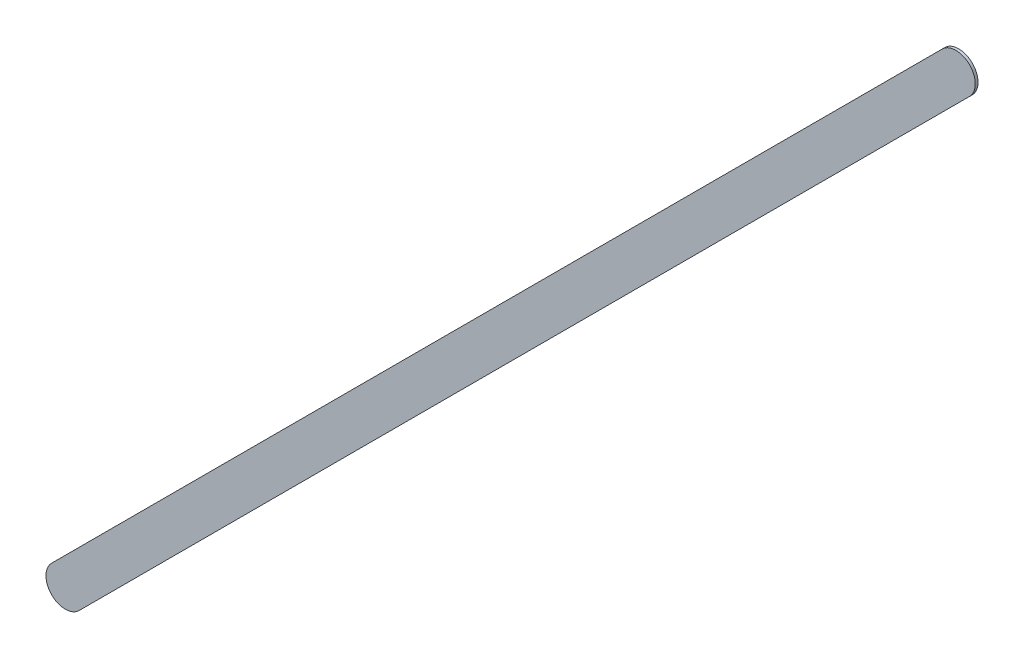
ISO-10303-21;
HEADER;
FILE_DESCRIPTION(('STEP AP214'),'2;1');
FILE_NAME('part.step','',(''),(''),'','','');
FILE_SCHEMA(('AUTOMOTIVE_DESIGN { 1 0 10303 214 1 1 1 1 }'));
ENDSEC;
DATA;
#1=APPLICATION_CONTEXT('core data for automotive mechanical design processes');
#2=APPLICATION_PROTOCOL_DEFINITION('international standard','automotive_design',2000,#1);
#3=PRODUCT_CONTEXT('',#1,'mechanical');
#4=PRODUCT('Part','Part','',(#3));
#5=PRODUCT_RELATED_PRODUCT_CATEGORY('part','',(#4));
#6=PRODUCT_DEFINITION_FORMATION('','',#4);
#7=PRODUCT_DEFINITION_CONTEXT('part definition',#1,'design');
#8=PRODUCT_DEFINITION('design','',#6,#7);
#9=PRODUCT_DEFINITION_SHAPE('','',#8);
#10=(LENGTH_UNIT() NAMED_UNIT(*) SI_UNIT(.MILLI.,.METRE.));
#11=(NAMED_UNIT(*) PLANE_ANGLE_UNIT() SI_UNIT($,.RADIAN.));
#12=(NAMED_UNIT(*) SI_UNIT($,.STERADIAN.) SOLID_ANGLE_UNIT());
#13=UNCERTAINTY_MEASURE_WITH_UNIT(LENGTH_MEASURE(1.E-05),#10,'distance_accuracy_value','');
#14=(GEOMETRIC_REPRESENTATION_CONTEXT(3) GLOBAL_UNCERTAINTY_ASSIGNED_CONTEXT((#13)) GLOBAL_UNIT_ASSIGNED_CONTEXT((#10,
#11,#12)) REPRESENTATION_CONTEXT('',''));
#15=CARTESIAN_POINT('',(0.,0.,0.));
#16=DIRECTION('',(0.,0.,1.));
#17=DIRECTION('',(1.,0.,0.));
#18=AXIS2_PLACEMENT_3D('',#15,#16,#17);
#19=CARTESIAN_POINT('',(52.07677672,80.32322264,0.));
#20=DIRECTION('',(-0.707106781186548,0.707106781186547,0.));
#21=DIRECTION('',(0.707106781186547,0.707106781186548,0.));
#22=AXIS2_PLACEMENT_3D('',#19,#20,#21);
#23=PLANE('',#22);
#24=DIRECTION('',(0.707106781186547,0.707106781186548,0.));
#25=VECTOR('',#24,1.);
#26=CARTESIAN_POINT('',(52.07677672,80.32322264,0.03556));
#27=LINE('',#26,#25);
#28=CARTESIAN_POINT('',(52.07677672,80.32322264,0.03556));
#29=VERTEX_POINT('',#28);
#30=CARTESIAN_POINT('',(63.57677658,91.8232225,0.03556));
#31=VERTEX_POINT('',#30);
#32=EDGE_CURVE('E11',#29,#31,#27,.T.);
#33=ORIENTED_EDGE('',*,*,#32,.F.);
#34=DIRECTION('',(0.,0.,1.));
#35=VECTOR('',#34,1.);
#36=CARTESIAN_POINT('',(52.07677672,80.32322264,0.));
#37=LINE('',#36,#35);
#38=CARTESIAN_POINT('',(52.07677672,80.32322264,0.));
#39=VERTEX_POINT('',#38);
#40=EDGE_CURVE('E24',#39,#29,#37,.T.);
#41=ORIENTED_EDGE('',*,*,#40,.F.);
#42=DIRECTION('',(0.707106781186547,0.707106781186548,0.));
#43=VECTOR('',#42,1.);
#44=CARTESIAN_POINT('',(52.07677672,80.32322264,0.));
#45=LINE('',#44,#43);
#46=CARTESIAN_POINT('',(63.57677658,91.8232225,0.));
#47=VERTEX_POINT('',#46);
#48=EDGE_CURVE('E75',#39,#47,#45,.T.);
#49=ORIENTED_EDGE('',*,*,#48,.T.);
#50=DIRECTION('',(0.,0.,1.));
#51=VECTOR('',#50,1.);
#52=CARTESIAN_POINT('',(63.57677658,91.8232225,0.));
#53=LINE('',#52,#51);
#54=EDGE_CURVE('E37',#47,#31,#53,.T.);
#55=ORIENTED_EDGE('',*,*,#54,.T.);
#56=EDGE_LOOP('',(#33,#41,#49,#55));
#57=FACE_BOUND('',#56,.T.);
#58=ADVANCED_FACE('F17',(#57),#23,.F.);
#59=CARTESIAN_POINT('',(63.4000002,91.99999888,0.));
#60=DIRECTION('',(0.,0.,-1.));
#61=DIRECTION('',(0.707106781186562,-0.707106781186533,0.));
#62=AXIS2_PLACEMENT_3D('',#59,#60,#61);
#63=CYLINDRICAL_SURFACE('',#62,0.24999955410322);
#64=CARTESIAN_POINT('',(63.4000002,91.99999888,0.03556));
#65=DIRECTION('',(0.,0.,1.));
#66=DIRECTION('',(0.707106781186562,-0.707106781186533,0.));
#67=AXIS2_PLACEMENT_3D('',#64,#65,#66);
#68=CIRCLE('',#67,0.24999955410322);
#69=CARTESIAN_POINT('',(63.22322382,92.17677526,0.03556));
#70=VERTEX_POINT('',#69);
#71=EDGE_CURVE('E83',#31,#70,#68,.T.);
#72=ORIENTED_EDGE('',*,*,#71,.F.);
#73=ORIENTED_EDGE('',*,*,#54,.F.);
#74=CARTESIAN_POINT('',(63.4000002,91.99999888,0.));
#75=DIRECTION('',(0.,0.,1.));
#76=DIRECTION('',(0.707106781186562,-0.707106781186533,0.));
#77=AXIS2_PLACEMENT_3D('',#74,#75,#76);
#78=CIRCLE('',#77,0.24999955410322);
#79=CARTESIAN_POINT('',(63.22322382,92.17677526,0.));
#80=VERTEX_POINT('',#79);
#81=EDGE_CURVE('E81',#47,#80,#78,.T.);
#82=ORIENTED_EDGE('',*,*,#81,.T.);
#83=DIRECTION('',(0.,0.,1.));
#84=VECTOR('',#83,1.);
#85=CARTESIAN_POINT('',(63.22322382,92.17677526,0.));
#86=LINE('',#85,#84);
#87=EDGE_CURVE('E67',#80,#70,#86,.T.);
#88=ORIENTED_EDGE('',*,*,#87,.T.);
#89=EDGE_LOOP('',(#72,#73,#82,#88));
#90=FACE_BOUND('',#89,.T.);
#91=ADVANCED_FACE('F89',(#90),#63,.T.);
#92=CARTESIAN_POINT('',(63.22322382,92.17677526,0.));
#93=DIRECTION('',(0.707106781186548,-0.707106781186548,0.));
#94=DIRECTION('',(-0.707106781186548,-0.707106781186548,0.));
#95=AXIS2_PLACEMENT_3D('',#92,#93,#94);
#96=PLANE('',#95);
#97=DIRECTION('',(-0.707106781186548,-0.707106781186548,0.));
#98=VECTOR('',#97,1.);
#99=CARTESIAN_POINT('',(63.22322382,92.17677526,0.03556));
#100=LINE('',#99,#98);
#101=CARTESIAN_POINT('',(51.72322396,80.6767754,0.03556));
#102=VERTEX_POINT('',#101);
#103=EDGE_CURVE('E71',#70,#102,#100,.T.);
#104=ORIENTED_EDGE('',*,*,#103,.F.);
#105=ORIENTED_EDGE('',*,*,#87,.F.);
#106=DIRECTION('',(-0.707106781186548,-0.707106781186548,0.));
#107=VECTOR('',#106,1.);
#108=CARTESIAN_POINT('',(63.22322382,92.17677526,0.));
#109=LINE('',#108,#107);
#110=CARTESIAN_POINT('',(51.72322396,80.6767754,0.));
#111=VERTEX_POINT('',#110);
#112=EDGE_CURVE('E63',#80,#111,#109,.T.);
#113=ORIENTED_EDGE('',*,*,#112,.T.);
#114=DIRECTION('',(0.,0.,1.));
#115=VECTOR('',#114,1.);
#116=CARTESIAN_POINT('',(51.72322396,80.6767754,0.));
#117=LINE('',#116,#115);
#118=EDGE_CURVE('E53',#111,#102,#117,.T.);
#119=ORIENTED_EDGE('',*,*,#118,.T.);
#120=EDGE_LOOP('',(#104,#105,#113,#119));
#121=FACE_BOUND('',#120,.T.);
#122=ADVANCED_FACE('F66',(#121),#96,.F.);
#123=CARTESIAN_POINT('',(51.90000034,80.49999902,0.));
#124=DIRECTION('',(0.,0.,-1.));
#125=DIRECTION('',(-0.707106781186533,0.707106781186562,0.));
#126=AXIS2_PLACEMENT_3D('',#123,#124,#125);
#127=CYLINDRICAL_SURFACE('',#126,0.249999554103218);
#128=CARTESIAN_POINT('',(51.90000034,80.49999902,0.03556));
#129=DIRECTION('',(0.,0.,1.));
#130=DIRECTION('',(-0.707106781186533,0.707106781186562,0.));
#131=AXIS2_PLACEMENT_3D('',#128,#129,#130);
#132=CIRCLE('',#131,0.249999554103218);
#133=EDGE_CURVE('E59',#102,#29,#132,.T.);
#134=ORIENTED_EDGE('',*,*,#133,.F.);
#135=ORIENTED_EDGE('',*,*,#118,.F.);
#136=CARTESIAN_POINT('',(51.90000034,80.49999902,0.));
#137=DIRECTION('',(0.,0.,1.));
#138=DIRECTION('',(-0.707106781186533,0.707106781186562,0.));
#139=AXIS2_PLACEMENT_3D('',#136,#137,#138);
#140=CIRCLE('',#139,0.249999554103218);
#141=EDGE_CURVE('E57',#111,#39,#140,.T.);
#142=ORIENTED_EDGE('',*,*,#141,.T.);
#143=ORIENTED_EDGE('',*,*,#40,.T.);
#144=EDGE_LOOP('',(#134,#135,#142,#143));
#145=FACE_BOUND('',#144,.T.);
#146=ADVANCED_FACE('F55',(#145),#127,.T.);
#147=CARTESIAN_POINT('',(52.07677672,80.32322264,0.));
#148=DIRECTION('',(0.,0.,-1.));
#149=DIRECTION('',(-1.,0.,0.));
#150=AXIS2_PLACEMENT_3D('',#147,#148,#149);
#151=PLANE('',#150);
#152=ORIENTED_EDGE('',*,*,#141,.F.);
#153=ORIENTED_EDGE('',*,*,#112,.F.);
#154=ORIENTED_EDGE('',*,*,#81,.F.);
#155=ORIENTED_EDGE('',*,*,#48,.F.);
#156=EDGE_LOOP('',(#152,#153,#154,#155));
#157=FACE_BOUND('',#156,.T.);
#158=ADVANCED_FACE('F74',(#157),#151,.T.);
#159=CARTESIAN_POINT('',(52.07677672,80.32322264,0.03556));
#160=DIRECTION('',(0.,0.,-1.));
#161=DIRECTION('',(-1.,0.,0.));
#162=AXIS2_PLACEMENT_3D('',#159,#160,#161);
#163=PLANE('',#162);
#164=ORIENTED_EDGE('',*,*,#32,.T.);
#165=ORIENTED_EDGE('',*,*,#71,.T.);
#166=ORIENTED_EDGE('',*,*,#103,.T.);
#167=ORIENTED_EDGE('',*,*,#133,.T.);
#168=EDGE_LOOP('',(#164,#165,#166,#167));
#169=FACE_BOUND('',#168,.T.);
#170=ADVANCED_FACE('F91',(#169),#163,.F.);
#171=CLOSED_SHELL('',(#58,#91,#122,#146,#158,#170));
#172=MANIFOLD_SOLID_BREP('B1',#171);
#173=ADVANCED_BREP_SHAPE_REPRESENTATION('',(#18,#172),#14);
#174=SHAPE_DEFINITION_REPRESENTATION(#9,#173);
ENDSEC;
END-ISO-10303-21;
